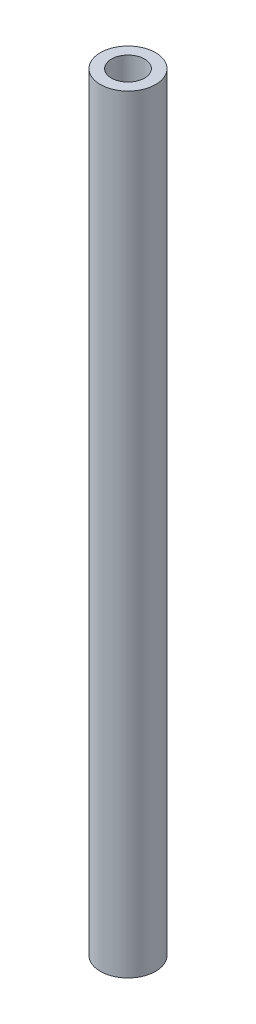
ISO-10303-21;
HEADER;
FILE_DESCRIPTION(('STEP AP214'),'2;1');
FILE_NAME('part.step','',(''),(''),'','','');
FILE_SCHEMA(('AUTOMOTIVE_DESIGN { 1 0 10303 214 1 1 1 1 }'));
ENDSEC;
DATA;
#1=APPLICATION_CONTEXT('core data for automotive mechanical design processes');
#2=APPLICATION_PROTOCOL_DEFINITION('international standard','automotive_design',2000,#1);
#3=PRODUCT_CONTEXT('',#1,'mechanical');
#4=PRODUCT('Part','Part','',(#3));
#5=PRODUCT_RELATED_PRODUCT_CATEGORY('part','',(#4));
#6=PRODUCT_DEFINITION_FORMATION('','',#4);
#7=PRODUCT_DEFINITION_CONTEXT('part definition',#1,'design');
#8=PRODUCT_DEFINITION('design','',#6,#7);
#9=PRODUCT_DEFINITION_SHAPE('','',#8);
#10=(LENGTH_UNIT() NAMED_UNIT(*) SI_UNIT(.MILLI.,.METRE.));
#11=(NAMED_UNIT(*) PLANE_ANGLE_UNIT() SI_UNIT($,.RADIAN.));
#12=(NAMED_UNIT(*) SI_UNIT($,.STERADIAN.) SOLID_ANGLE_UNIT());
#13=UNCERTAINTY_MEASURE_WITH_UNIT(LENGTH_MEASURE(1.E-05),#10,'distance_accuracy_value','');
#14=(GEOMETRIC_REPRESENTATION_CONTEXT(3) GLOBAL_UNCERTAINTY_ASSIGNED_CONTEXT((#13)) GLOBAL_UNIT_ASSIGNED_CONTEXT((#10,
#11,#12)) REPRESENTATION_CONTEXT('',''));
#15=CARTESIAN_POINT('',(0.,0.,0.));
#16=DIRECTION('',(0.,0.,1.));
#17=DIRECTION('',(1.,0.,0.));
#18=AXIS2_PLACEMENT_3D('',#15,#16,#17);
#19=CARTESIAN_POINT('',(0.,13.9,0.));
#20=DIRECTION('',(0.,-1.,0.));
#21=DIRECTION('',(0.,0.,-1.));
#22=AXIS2_PLACEMENT_3D('',#19,#20,#21);
#23=CYLINDRICAL_SURFACE('',#22,0.5);
#24=CARTESIAN_POINT('',(0.,13.9,0.));
#25=DIRECTION('',(0.,1.,0.));
#26=DIRECTION('',(0.,0.,1.));
#27=AXIS2_PLACEMENT_3D('',#24,#25,#26);
#28=CIRCLE('',#27,0.5);
#29=CARTESIAN_POINT('',(0.,13.9,0.5));
#30=VERTEX_POINT('',#29);
#31=EDGE_CURVE('E10',#30,#30,#28,.T.);
#32=ORIENTED_EDGE('',*,*,#31,.F.);
#33=EDGE_LOOP('',(#32));
#34=FACE_BOUND('',#33,.T.);
#35=CARTESIAN_POINT('',(0.,0.,0.));
#36=DIRECTION('',(0.,1.,0.));
#37=DIRECTION('',(0.,0.,1.));
#38=AXIS2_PLACEMENT_3D('',#35,#36,#37);
#39=CIRCLE('',#38,0.5);
#40=CARTESIAN_POINT('',(0.,0.,0.5));
#41=VERTEX_POINT('',#40);
#42=EDGE_CURVE('E37',#41,#41,#39,.T.);
#43=ORIENTED_EDGE('',*,*,#42,.T.);
#44=EDGE_LOOP('',(#43));
#45=FACE_BOUND('',#44,.T.);
#46=ADVANCED_FACE('F30',(#34,#45),#23,.T.);
#47=CARTESIAN_POINT('',(0.,13.9,0.));
#48=DIRECTION('',(0.,1.,0.));
#49=DIRECTION('',(0.,0.,1.));
#50=AXIS2_PLACEMENT_3D('',#47,#48,#49);
#51=PLANE('',#50);
#52=CARTESIAN_POINT('',(0.,13.9,0.));
#53=DIRECTION('',(0.,1.,0.));
#54=DIRECTION('',(0.,0.,1.));
#55=AXIS2_PLACEMENT_3D('',#52,#53,#54);
#56=CIRCLE('',#55,0.299999999999999);
#57=CARTESIAN_POINT('',(0.,13.9,0.299999999999999));
#58=VERTEX_POINT('',#57);
#59=EDGE_CURVE('E51',#58,#58,#56,.T.);
#60=ORIENTED_EDGE('',*,*,#59,.F.);
#61=EDGE_LOOP('',(#60));
#62=FACE_BOUND('',#61,.T.);
#63=ORIENTED_EDGE('',*,*,#31,.T.);
#64=EDGE_LOOP('',(#63));
#65=FACE_BOUND('',#64,.T.);
#66=ADVANCED_FACE('F72',(#62,#65),#51,.T.);
#67=CARTESIAN_POINT('',(0.,0.,0.));
#68=DIRECTION('',(0.,1.,0.));
#69=DIRECTION('',(0.,0.,1.));
#70=AXIS2_PLACEMENT_3D('',#67,#68,#69);
#71=PLANE('',#70);
#72=CARTESIAN_POINT('',(0.,0.,0.));
#73=DIRECTION('',(0.,-1.,0.));
#74=DIRECTION('',(0.,0.,-1.));
#75=AXIS2_PLACEMENT_3D('',#72,#73,#74);
#76=CIRCLE('',#75,0.299999999999989);
#77=CARTESIAN_POINT('',(0.,0.,-0.299999999999989));
#78=VERTEX_POINT('',#77);
#79=EDGE_CURVE('E62',#78,#78,#76,.T.);
#80=ORIENTED_EDGE('',*,*,#79,.F.);
#81=EDGE_LOOP('',(#80));
#82=FACE_BOUND('',#81,.T.);
#83=ORIENTED_EDGE('',*,*,#42,.F.);
#84=EDGE_LOOP('',(#83));
#85=FACE_BOUND('',#84,.T.);
#86=ADVANCED_FACE('F68',(#82,#85),#71,.F.);
#87=CARTESIAN_POINT('',(0.,13.9,0.));
#88=DIRECTION('',(0.,1.,0.));
#89=DIRECTION('',(0.,0.,1.));
#90=AXIS2_PLACEMENT_3D('',#87,#88,#89);
#91=CYLINDRICAL_SURFACE('',#90,0.199999999999992);
#92=CARTESIAN_POINT('',(0.,3.06008606190276,0.));
#93=DIRECTION('',(0.,-1.,0.));
#94=DIRECTION('',(0.,0.,-1.));
#95=AXIS2_PLACEMENT_3D('',#92,#93,#94);
#96=CIRCLE('',#95,0.199999999999992);
#97=CARTESIAN_POINT('',(0.,3.06008606190276,-0.199999999999992));
#98=VERTEX_POINT('',#97);
#99=EDGE_CURVE('E33',#98,#98,#96,.T.);
#100=ORIENTED_EDGE('',*,*,#99,.T.);
#101=EDGE_LOOP('',(#100));
#102=FACE_BOUND('',#101,.T.);
#103=CARTESIAN_POINT('',(0.,10.8399139380972,0.));
#104=DIRECTION('',(0.,1.,0.));
#105=DIRECTION('',(0.,0.,1.));
#106=AXIS2_PLACEMENT_3D('',#103,#104,#105);
#107=CIRCLE('',#106,0.199999999999992);
#108=CARTESIAN_POINT('',(0.,10.8399139380972,0.199999999999992));
#109=VERTEX_POINT('',#108);
#110=EDGE_CURVE('E42',#109,#109,#107,.T.);
#111=ORIENTED_EDGE('',*,*,#110,.T.);
#112=EDGE_LOOP('',(#111));
#113=FACE_BOUND('',#112,.T.);
#114=ADVANCED_FACE('F71',(#102,#113),#91,.F.);
#115=CARTESIAN_POINT('',(0.,10.9,0.));
#116=DIRECTION('',(0.,1.,0.));
#117=DIRECTION('',(0.,0.,1.));
#118=AXIS2_PLACEMENT_3D('',#115,#116,#117);
#119=CONICAL_SURFACE('',#118,0.299999999999998,1.02974425867665);
#120=CARTESIAN_POINT('',(0.,10.9,0.));
#121=DIRECTION('',(0.,1.,0.));
#122=DIRECTION('',(0.,0.,1.));
#123=AXIS2_PLACEMENT_3D('',#120,#121,#122);
#124=CIRCLE('',#123,0.299999999999998);
#125=CARTESIAN_POINT('',(0.,10.9,0.299999999999998));
#126=VERTEX_POINT('',#125);
#127=EDGE_CURVE('E45',#126,#126,#124,.T.);
#128=ORIENTED_EDGE('',*,*,#127,.T.);
#129=EDGE_LOOP('',(#128));
#130=FACE_BOUND('',#129,.T.);
#131=ORIENTED_EDGE('',*,*,#110,.F.);
#132=EDGE_LOOP('',(#131));
#133=FACE_BOUND('',#132,.T.);
#134=ADVANCED_FACE('F87',(#130,#133),#119,.F.);
#135=CARTESIAN_POINT('',(0.,13.9,0.));
#136=DIRECTION('',(0.,1.,0.));
#137=DIRECTION('',(0.,0.,1.));
#138=AXIS2_PLACEMENT_3D('',#135,#136,#137);
#139=CYLINDRICAL_SURFACE('',#138,0.299999999999999);
#140=ORIENTED_EDGE('',*,*,#127,.F.);
#141=EDGE_LOOP('',(#140));
#142=FACE_BOUND('',#141,.T.);
#143=ORIENTED_EDGE('',*,*,#59,.T.);
#144=EDGE_LOOP('',(#143));
#145=FACE_BOUND('',#144,.T.);
#146=ADVANCED_FACE('F91',(#142,#145),#139,.F.);
#147=CARTESIAN_POINT('',(0.,3.,0.));
#148=DIRECTION('',(0.,-1.,0.));
#149=DIRECTION('',(0.,0.,-1.));
#150=AXIS2_PLACEMENT_3D('',#147,#148,#149);
#151=CONICAL_SURFACE('',#150,0.299999999999988,1.02974425867664);
#152=CARTESIAN_POINT('',(0.,3.,0.));
#153=DIRECTION('',(0.,-1.,0.));
#154=DIRECTION('',(0.,0.,-1.));
#155=AXIS2_PLACEMENT_3D('',#152,#153,#154);
#156=CIRCLE('',#155,0.299999999999988);
#157=CARTESIAN_POINT('',(0.,3.,-0.299999999999988));
#158=VERTEX_POINT('',#157);
#159=EDGE_CURVE('E58',#158,#158,#156,.T.);
#160=ORIENTED_EDGE('',*,*,#159,.T.);
#161=EDGE_LOOP('',(#160));
#162=FACE_BOUND('',#161,.T.);
#163=ORIENTED_EDGE('',*,*,#99,.F.);
#164=EDGE_LOOP('',(#163));
#165=FACE_BOUND('',#164,.T.);
#166=ADVANCED_FACE('F94',(#162,#165),#151,.F.);
#167=CARTESIAN_POINT('',(0.,0.,0.));
#168=DIRECTION('',(0.,-1.,0.));
#169=DIRECTION('',(0.,0.,-1.));
#170=AXIS2_PLACEMENT_3D('',#167,#168,#169);
#171=CYLINDRICAL_SURFACE('',#170,0.299999999999989);
#172=ORIENTED_EDGE('',*,*,#159,.F.);
#173=EDGE_LOOP('',(#172));
#174=FACE_BOUND('',#173,.T.);
#175=ORIENTED_EDGE('',*,*,#79,.T.);
#176=EDGE_LOOP('',(#175));
#177=FACE_BOUND('',#176,.T.);
#178=ADVANCED_FACE('F66',(#174,#177),#171,.F.);
#179=CLOSED_SHELL('',(#46,#66,#86,#114,#134,#146,#166,#178));
#180=MANIFOLD_SOLID_BREP('B2',#179);
#181=ADVANCED_BREP_SHAPE_REPRESENTATION('',(#18,#180),#14);
#182=SHAPE_DEFINITION_REPRESENTATION(#9,#181);
ENDSEC;
END-ISO-10303-21;
